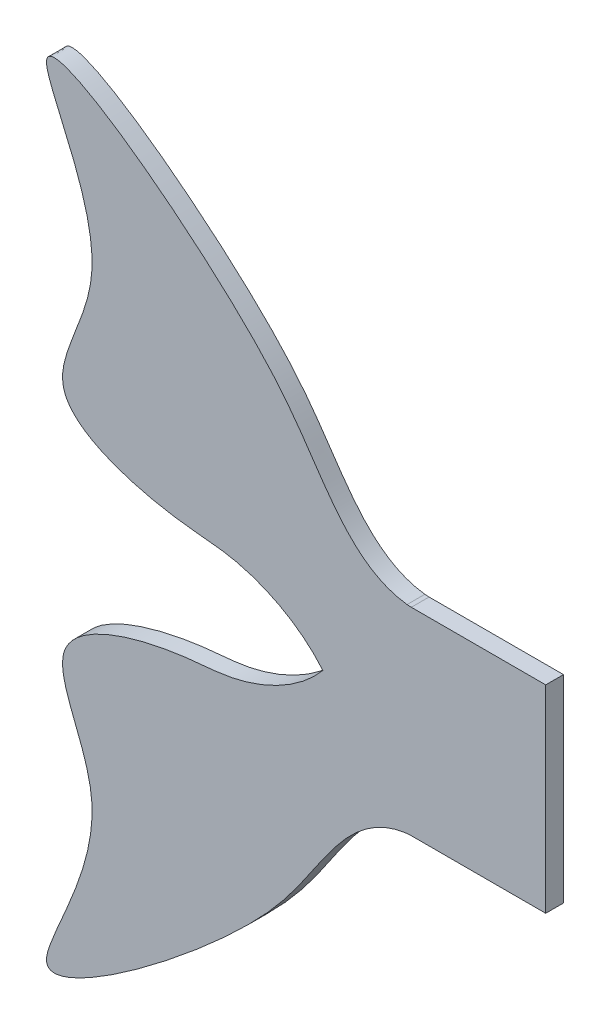
ISO-10303-21;
HEADER;
FILE_DESCRIPTION(('STEP AP214'),'2;1');
FILE_NAME('part.step','',(''),(''),'','','');
FILE_SCHEMA(('AUTOMOTIVE_DESIGN { 1 0 10303 214 1 1 1 1 }'));
ENDSEC;
DATA;
#1=APPLICATION_CONTEXT('core data for automotive mechanical design processes');
#2=APPLICATION_PROTOCOL_DEFINITION('international standard','automotive_design',2000,#1);
#3=PRODUCT_CONTEXT('',#1,'mechanical');
#4=PRODUCT('Part','Part','',(#3));
#5=PRODUCT_RELATED_PRODUCT_CATEGORY('part','',(#4));
#6=PRODUCT_DEFINITION_FORMATION('','',#4);
#7=PRODUCT_DEFINITION_CONTEXT('part definition',#1,'design');
#8=PRODUCT_DEFINITION('design','',#6,#7);
#9=PRODUCT_DEFINITION_SHAPE('','',#8);
#10=(LENGTH_UNIT() NAMED_UNIT(*) SI_UNIT(.MILLI.,.METRE.));
#11=(NAMED_UNIT(*) PLANE_ANGLE_UNIT() SI_UNIT($,.RADIAN.));
#12=(NAMED_UNIT(*) SI_UNIT($,.STERADIAN.) SOLID_ANGLE_UNIT());
#13=UNCERTAINTY_MEASURE_WITH_UNIT(LENGTH_MEASURE(1.E-05),#10,'distance_accuracy_value','');
#14=(GEOMETRIC_REPRESENTATION_CONTEXT(3) GLOBAL_UNCERTAINTY_ASSIGNED_CONTEXT((#13)) GLOBAL_UNIT_ASSIGNED_CONTEXT((#10,
#11,#12)) REPRESENTATION_CONTEXT('',''));
#15=CARTESIAN_POINT('',(0.,0.,0.));
#16=DIRECTION('',(0.,0.,1.));
#17=DIRECTION('',(1.,0.,0.));
#18=AXIS2_PLACEMENT_3D('',#15,#16,#17);
#19=CARTESIAN_POINT('',(63.9983128002623,-14.1655858292045,1.5));
#20=DIRECTION('',(0.,1.,0.));
#21=DIRECTION('',(0.,0.,1.));
#22=AXIS2_PLACEMENT_3D('',#19,#20,#21);
#23=PLANE('',#22);
#24=DIRECTION('',(1.,0.,0.));
#25=VECTOR('',#24,1.);
#26=CARTESIAN_POINT('',(63.9983128002623,-14.1655858292045,1.5));
#27=LINE('',#26,#25);
#28=CARTESIAN_POINT('',(41.3083859069393,-14.1655858292045,1.5));
#29=VERTEX_POINT('',#28);
#30=CARTESIAN_POINT('',(63.9983128002623,-14.1655858292045,1.5));
#31=VERTEX_POINT('',#30);
#32=EDGE_CURVE('E93',#29,#31,#27,.T.);
#33=ORIENTED_EDGE('',*,*,#32,.F.);
#34=DIRECTION('',(0.,0.,1.));
#35=VECTOR('',#34,1.);
#36=CARTESIAN_POINT('',(41.3083859069393,-14.1655858292045,-1.5));
#37=LINE('',#36,#35);
#38=CARTESIAN_POINT('',(41.3083859069393,-14.1655858292045,-1.5));
#39=VERTEX_POINT('',#38);
#40=EDGE_CURVE('E127',#29,#39,#37,.F.);
#41=ORIENTED_EDGE('',*,*,#40,.T.);
#42=DIRECTION('',(1.,0.,0.));
#43=VECTOR('',#42,1.);
#44=CARTESIAN_POINT('',(63.9983128002623,-14.1655858292045,-1.5));
#45=LINE('',#44,#43);
#46=CARTESIAN_POINT('',(63.9983128002623,-14.1655858292045,-1.5));
#47=VERTEX_POINT('',#46);
#48=EDGE_CURVE('E115',#39,#47,#45,.T.);
#49=ORIENTED_EDGE('',*,*,#48,.T.);
#50=DIRECTION('',(0.,0.,-1.));
#51=VECTOR('',#50,1.);
#52=CARTESIAN_POINT('',(63.9983128002623,-14.1655858292045,1.5));
#53=LINE('',#52,#51);
#54=EDGE_CURVE('E109',#31,#47,#53,.T.);
#55=ORIENTED_EDGE('',*,*,#54,.F.);
#56=EDGE_LOOP('',(#33,#41,#49,#55));
#57=FACE_BOUND('',#56,.T.);
#58=ADVANCED_FACE('F35',(#57),#23,.F.);
#59=CARTESIAN_POINT('',(63.9983128002623,19.2344141707955,1.5));
#60=DIRECTION('',(-1.,0.,0.));
#61=DIRECTION('',(0.,0.,1.));
#62=AXIS2_PLACEMENT_3D('',#59,#60,#61);
#63=PLANE('',#62);
#64=DIRECTION('',(0.,1.,0.));
#65=VECTOR('',#64,1.);
#66=CARTESIAN_POINT('',(63.9983128002623,19.2344141707955,-1.5));
#67=LINE('',#66,#65);
#68=CARTESIAN_POINT('',(63.9983128002623,19.2344141707955,-1.5));
#69=VERTEX_POINT('',#68);
#70=EDGE_CURVE('E154',#47,#69,#67,.T.);
#71=ORIENTED_EDGE('',*,*,#70,.T.);
#72=DIRECTION('',(0.,0.,-1.));
#73=VECTOR('',#72,1.);
#74=CARTESIAN_POINT('',(63.9983128002623,19.2344141707955,1.5));
#75=LINE('',#74,#73);
#76=CARTESIAN_POINT('',(63.9983128002623,19.2344141707955,1.5));
#77=VERTEX_POINT('',#76);
#78=EDGE_CURVE('E111',#77,#69,#75,.T.);
#79=ORIENTED_EDGE('',*,*,#78,.F.);
#80=DIRECTION('',(0.,1.,0.));
#81=VECTOR('',#80,1.);
#82=CARTESIAN_POINT('',(63.9983128002623,19.2344141707955,1.5));
#83=LINE('',#82,#81);
#84=EDGE_CURVE('E97',#31,#77,#83,.T.);
#85=ORIENTED_EDGE('',*,*,#84,.F.);
#86=ORIENTED_EDGE('',*,*,#54,.T.);
#87=EDGE_LOOP('',(#71,#79,#85,#86));
#88=FACE_BOUND('',#87,.T.);
#89=ADVANCED_FACE('F108',(#88),#63,.F.);
#90=CARTESIAN_POINT('',(40.9983128002623,19.2344141707955,1.5));
#91=DIRECTION('',(0.,-1.,0.));
#92=DIRECTION('',(0.,0.,-1.));
#93=AXIS2_PLACEMENT_3D('',#90,#91,#92);
#94=PLANE('',#93);
#95=DIRECTION('',(-1.,0.,0.));
#96=VECTOR('',#95,1.);
#97=CARTESIAN_POINT('',(40.9983128002623,19.2344141707955,-1.5));
#98=LINE('',#97,#96);
#99=CARTESIAN_POINT('',(41.3083859069393,19.2344141707955,-1.5));
#100=VERTEX_POINT('',#99);
#101=EDGE_CURVE('E150',#69,#100,#98,.T.);
#102=ORIENTED_EDGE('',*,*,#101,.T.);
#103=DIRECTION('',(0.,0.,1.));
#104=VECTOR('',#103,1.);
#105=CARTESIAN_POINT('',(41.3083859069393,19.2344141707955,1.5));
#106=LINE('',#105,#104);
#107=CARTESIAN_POINT('',(41.3083859069393,19.2344141707955,1.5));
#108=VERTEX_POINT('',#107);
#109=EDGE_CURVE('E120',#100,#108,#106,.T.);
#110=ORIENTED_EDGE('',*,*,#109,.T.);
#111=DIRECTION('',(-1.,0.,0.));
#112=VECTOR('',#111,1.);
#113=CARTESIAN_POINT('',(40.9983128002623,19.2344141707955,1.5));
#114=LINE('',#113,#112);
#115=EDGE_CURVE('E113',#77,#108,#114,.T.);
#116=ORIENTED_EDGE('',*,*,#115,.F.);
#117=ORIENTED_EDGE('',*,*,#78,.T.);
#118=EDGE_LOOP('',(#102,#110,#116,#117));
#119=FACE_BOUND('',#118,.T.);
#120=ADVANCED_FACE('F153',(#119),#94,.F.);
#121=CARTESIAN_POINT('',(40.9983128002623,19.2344141707955,1.5));
#122=CARTESIAN_POINT('',(33.0489985134995,19.9612706710081,1.5));
#123=CARTESIAN_POINT('',(26.1078954770711,30.7105304897868,1.5));
#124=CARTESIAN_POINT('',(12.3574373838586,50.2099376191377,1.5));
#125=CARTESIAN_POINT('',(-35.2203706690761,85.7568457216216,1.5));
#126=CARTESIAN_POINT('',(-5.41329581993475,43.0049972683398,1.5));
#127=CARTESIAN_POINT('',(-25.0750941262015,18.7796393025361,1.5));
#128=CARTESIAN_POINT('',(-1.32849307768516,12.2112218211496,1.5));
#129=CARTESIAN_POINT('',(13.9745120443587,11.5420312222955,1.5));
#130=CARTESIAN_POINT('',(22.4755953185508,7.21440777383797,1.5));
#131=CARTESIAN_POINT('',(26.3732822600986,2.53441417079552,1.5));
#132=B_SPLINE_CURVE_WITH_KNOTS('',3,(#121,#122,#123,#124,#125,#126,#127,#128,#129,#130,#131),
.UNSPECIFIED.,.F.,.F.,(4,1,1,1,1,1,1,1,4),(0.,0.125076558999509,0.192560443302829,
0.451722325209279,0.613213328041452,0.726080796191922,0.854297924022221,0.895646716017692,1.),.UNSPECIFIED.);
#133=DIRECTION('',(0.,0.,-1.));
#134=VECTOR('',#133,1.);
#135=SURFACE_OF_LINEAR_EXTRUSION('',#132,#134);
#136=CARTESIAN_POINT('',(40.5951147383255,19.2769613392555,1.5));
#137=VERTEX_POINT('',#136);
#138=CARTESIAN_POINT('',(26.3732822600986,2.53441417079552,1.5));
#139=VERTEX_POINT('',#138);
#140=EDGE_CURVE('E135',#137,#139,#132,.T.);
#141=ORIENTED_EDGE('',*,*,#140,.F.);
#142=DIRECTION('',(0.,0.,-1.));
#143=VECTOR('',#142,1.);
#144=CARTESIAN_POINT('',(40.5951147383253,19.2769613392555,1.5));
#145=LINE('',#144,#143);
#146=CARTESIAN_POINT('',(40.5951147383255,19.2769613392555,-1.5));
#147=VERTEX_POINT('',#146);
#148=EDGE_CURVE('E117',#137,#147,#145,.T.);
#149=ORIENTED_EDGE('',*,*,#148,.T.);
#150=CARTESIAN_POINT('',(40.9983128002623,19.2344141707955,-1.5));
#151=CARTESIAN_POINT('',(33.0489985134995,19.9612706710081,-1.5));
#152=CARTESIAN_POINT('',(26.1078954770711,30.7105304897868,-1.5));
#153=CARTESIAN_POINT('',(12.3574373838586,50.2099376191377,-1.5));
#154=CARTESIAN_POINT('',(-35.2203706690761,85.7568457216216,-1.5));
#155=CARTESIAN_POINT('',(-5.41329581993475,43.0049972683398,-1.5));
#156=CARTESIAN_POINT('',(-25.0750941262015,18.7796393025361,-1.5));
#157=CARTESIAN_POINT('',(-1.32849307768516,12.2112218211496,-1.5));
#158=CARTESIAN_POINT('',(13.9745120443587,11.5420312222955,-1.5));
#159=CARTESIAN_POINT('',(22.4755953185508,7.21440777383797,-1.5));
#160=CARTESIAN_POINT('',(26.3732822600986,2.53441417079552,-1.5));
#161=B_SPLINE_CURVE_WITH_KNOTS('',3,(#150,#151,#152,#153,#154,#155,#156,#157,#158,#159,#160),
.UNSPECIFIED.,.F.,.F.,(4,1,1,1,1,1,1,1,4),(0.,0.125076558999509,0.192560443302829,
0.451722325209279,0.613213328041452,0.726080796191922,0.854297924022221,0.895646716017692,1.),.UNSPECIFIED.);
#162=CARTESIAN_POINT('',(26.3732822600986,2.53441417079552,-1.5));
#163=VERTEX_POINT('',#162);
#164=EDGE_CURVE('E151',#147,#163,#161,.T.);
#165=ORIENTED_EDGE('',*,*,#164,.T.);
#166=DIRECTION('',(0.,0.,-1.));
#167=VECTOR('',#166,1.);
#168=CARTESIAN_POINT('',(26.3732822600986,2.53441417079552,1.5));
#169=LINE('',#168,#167);
#170=EDGE_CURVE('E122',#139,#163,#169,.T.);
#171=ORIENTED_EDGE('',*,*,#170,.F.);
#172=EDGE_LOOP('',(#141,#149,#165,#171));
#173=FACE_BOUND('',#172,.T.);
#174=ADVANCED_FACE('F141',(#173),#135,.F.);
#175=CARTESIAN_POINT('',(26.3732822600986,2.53441417079555,1.5));
#176=CARTESIAN_POINT('',(22.4755953185508,-2.1455794322469,1.5));
#177=CARTESIAN_POINT('',(13.9745120443587,-6.4732028807044,1.5));
#178=CARTESIAN_POINT('',(-1.32849307768516,-7.14239347955853,1.5));
#179=CARTESIAN_POINT('',(-25.0750941262015,-13.7108109609451,1.5));
#180=CARTESIAN_POINT('',(-5.41329581993475,-37.9361689267487,1.5));
#181=CARTESIAN_POINT('',(-35.2203706690761,-80.6880173800305,1.5));
#182=CARTESIAN_POINT('',(12.3574373838586,-45.1411092775466,1.5));
#183=CARTESIAN_POINT('',(26.1078954770711,-25.6417021481957,1.5));
#184=CARTESIAN_POINT('',(33.0489985134995,-14.8924423294171,1.5));
#185=CARTESIAN_POINT('',(40.9983128002623,-14.1655858292045,1.5));
#186=B_SPLINE_CURVE_WITH_KNOTS('',3,(#175,#176,#177,#178,#179,#180,#181,#182,#183,#184,#185),
.UNSPECIFIED.,.F.,.F.,(4,1,1,1,1,1,1,1,4),(0.,0.104353283982308,0.145702075977779,
0.273919203808078,0.386786671958548,0.548277674790721,0.807439556697171,0.874923441000491,1.),.UNSPECIFIED.);
#187=DIRECTION('',(0.,0.,-1.));
#188=VECTOR('',#187,1.);
#189=SURFACE_OF_LINEAR_EXTRUSION('',#186,#188);
#190=CARTESIAN_POINT('',(26.3732822600986,2.53441417079555,-1.5));
#191=CARTESIAN_POINT('',(22.4755953185508,-2.1455794322469,-1.5));
#192=CARTESIAN_POINT('',(13.9745120443587,-6.4732028807044,-1.5));
#193=CARTESIAN_POINT('',(-1.32849307768516,-7.14239347955853,-1.5));
#194=CARTESIAN_POINT('',(-25.0750941262015,-13.7108109609451,-1.5));
#195=CARTESIAN_POINT('',(-5.41329581993475,-37.9361689267487,-1.5));
#196=CARTESIAN_POINT('',(-35.2203706690761,-80.6880173800305,-1.5));
#197=CARTESIAN_POINT('',(12.3574373838586,-45.1411092775466,-1.5));
#198=CARTESIAN_POINT('',(26.1078954770711,-25.6417021481957,-1.5));
#199=CARTESIAN_POINT('',(33.0489985134995,-14.8924423294171,-1.5));
#200=CARTESIAN_POINT('',(40.9983128002623,-14.1655858292045,-1.5));
#201=B_SPLINE_CURVE_WITH_KNOTS('',3,(#190,#191,#192,#193,#194,#195,#196,#197,#198,#199,#200),
.UNSPECIFIED.,.F.,.F.,(4,1,1,1,1,1,1,1,4),(0.,0.104353283982308,0.145702075977779,
0.273919203808078,0.386786671958548,0.548277674790721,0.807439556697171,0.874923441000491,1.),.UNSPECIFIED.);
#202=CARTESIAN_POINT('',(40.5951147383255,-14.2081329976644,-1.5));
#203=VERTEX_POINT('',#202);
#204=EDGE_CURVE('E104',#163,#203,#201,.T.);
#205=ORIENTED_EDGE('',*,*,#204,.T.);
#206=DIRECTION('',(0.,0.,-1.));
#207=VECTOR('',#206,1.);
#208=CARTESIAN_POINT('',(40.5951147383253,-14.2081329976645,-1.5));
#209=LINE('',#208,#207);
#210=CARTESIAN_POINT('',(40.5951147383255,-14.2081329976644,1.5));
#211=VERTEX_POINT('',#210);
#212=EDGE_CURVE('E50',#203,#211,#209,.F.);
#213=ORIENTED_EDGE('',*,*,#212,.T.);
#214=EDGE_CURVE('E144',#139,#211,#186,.T.);
#215=ORIENTED_EDGE('',*,*,#214,.F.);
#216=ORIENTED_EDGE('',*,*,#170,.T.);
#217=EDGE_LOOP('',(#205,#213,#215,#216));
#218=FACE_BOUND('',#217,.T.);
#219=ADVANCED_FACE('F182',(#218),#189,.F.);
#220=CARTESIAN_POINT('',(-18.6625011343518,-58.0392421923886,1.5));
#221=DIRECTION('',(0.,0.,-1.));
#222=DIRECTION('',(-1.,0.,0.));
#223=AXIS2_PLACEMENT_3D('',#220,#221,#222);
#224=PLANE('',#223);
#225=ORIENTED_EDGE('',*,*,#214,.T.);
#226=CARTESIAN_POINT('',(41.3083859069393,-20.1655858292045,1.5));
#227=DIRECTION('',(0.,0.,-1.));
#228=DIRECTION('',(-1.,0.,0.));
#229=AXIS2_PLACEMENT_3D('',#226,#227,#228);
#230=CIRCLE('',#229,6.);
#231=EDGE_CURVE('E11',#211,#29,#230,.T.);
#232=ORIENTED_EDGE('',*,*,#231,.T.);
#233=ORIENTED_EDGE('',*,*,#32,.T.);
#234=ORIENTED_EDGE('',*,*,#84,.T.);
#235=ORIENTED_EDGE('',*,*,#115,.T.);
#236=CARTESIAN_POINT('',(41.3083859069393,25.2344141707955,1.5));
#237=DIRECTION('',(0.,0.,-1.));
#238=DIRECTION('',(-1.,0.,0.));
#239=AXIS2_PLACEMENT_3D('',#236,#237,#238);
#240=CIRCLE('',#239,6.);
#241=EDGE_CURVE('E132',#108,#137,#240,.T.);
#242=ORIENTED_EDGE('',*,*,#241,.T.);
#243=ORIENTED_EDGE('',*,*,#140,.T.);
#244=EDGE_LOOP('',(#225,#232,#233,#234,#235,#242,#243));
#245=FACE_BOUND('',#244,.T.);
#246=ADVANCED_FACE('F95',(#245),#224,.F.);
#247=CARTESIAN_POINT('',(-18.6625011343518,-58.0392421923886,-1.5));
#248=DIRECTION('',(0.,0.,-1.));
#249=DIRECTION('',(-1.,0.,0.));
#250=AXIS2_PLACEMENT_3D('',#247,#248,#249);
#251=PLANE('',#250);
#252=ORIENTED_EDGE('',*,*,#48,.F.);
#253=CARTESIAN_POINT('',(41.3083859069393,-20.1655858292045,-1.5));
#254=DIRECTION('',(0.,0.,-1.));
#255=DIRECTION('',(-1.,0.,0.));
#256=AXIS2_PLACEMENT_3D('',#253,#254,#255);
#257=CIRCLE('',#256,6.);
#258=EDGE_CURVE('E43',#39,#203,#257,.F.);
#259=ORIENTED_EDGE('',*,*,#258,.T.);
#260=ORIENTED_EDGE('',*,*,#204,.F.);
#261=ORIENTED_EDGE('',*,*,#164,.F.);
#262=CARTESIAN_POINT('',(41.3083859069393,25.2344141707955,-1.5));
#263=DIRECTION('',(0.,0.,-1.));
#264=DIRECTION('',(-1.,0.,0.));
#265=AXIS2_PLACEMENT_3D('',#262,#263,#264);
#266=CIRCLE('',#265,6.);
#267=EDGE_CURVE('E130',#147,#100,#266,.F.);
#268=ORIENTED_EDGE('',*,*,#267,.T.);
#269=ORIENTED_EDGE('',*,*,#101,.F.);
#270=ORIENTED_EDGE('',*,*,#70,.F.);
#271=EDGE_LOOP('',(#252,#259,#260,#261,#268,#269,#270));
#272=FACE_BOUND('',#271,.T.);
#273=ADVANCED_FACE('F149',(#272),#251,.T.);
#274=CARTESIAN_POINT('',(41.3083859069393,25.2344141707955,0.));
#275=DIRECTION('',(0.,0.,-1.));
#276=DIRECTION('',(-1.,0.,0.));
#277=AXIS2_PLACEMENT_3D('',#274,#275,#276);
#278=CYLINDRICAL_SURFACE('',#277,6.);
#279=ORIENTED_EDGE('',*,*,#241,.F.);
#280=ORIENTED_EDGE('',*,*,#109,.F.);
#281=ORIENTED_EDGE('',*,*,#267,.F.);
#282=ORIENTED_EDGE('',*,*,#148,.F.);
#283=EDGE_LOOP('',(#279,#280,#281,#282));
#284=FACE_BOUND('',#283,.T.);
#285=ADVANCED_FACE('F146',(#284),#278,.F.);
#286=CARTESIAN_POINT('',(41.3083859069393,-20.1655858292045,0.));
#287=DIRECTION('',(0.,0.,-1.));
#288=DIRECTION('',(-1.,0.,0.));
#289=AXIS2_PLACEMENT_3D('',#286,#287,#288);
#290=CYLINDRICAL_SURFACE('',#289,6.);
#291=ORIENTED_EDGE('',*,*,#231,.F.);
#292=ORIENTED_EDGE('',*,*,#212,.F.);
#293=ORIENTED_EDGE('',*,*,#258,.F.);
#294=ORIENTED_EDGE('',*,*,#40,.F.);
#295=EDGE_LOOP('',(#291,#292,#293,#294));
#296=FACE_BOUND('',#295,.T.);
#297=ADVANCED_FACE('F37',(#296),#290,.F.);
#298=CLOSED_SHELL('',(#58,#89,#120,#174,#219,#246,#273,#285,#297));
#299=MANIFOLD_SOLID_BREP('B2',#298);
#300=ADVANCED_BREP_SHAPE_REPRESENTATION('',(#18,#299),#14);
#301=SHAPE_DEFINITION_REPRESENTATION(#9,#300);
ENDSEC;
END-ISO-10303-21;
